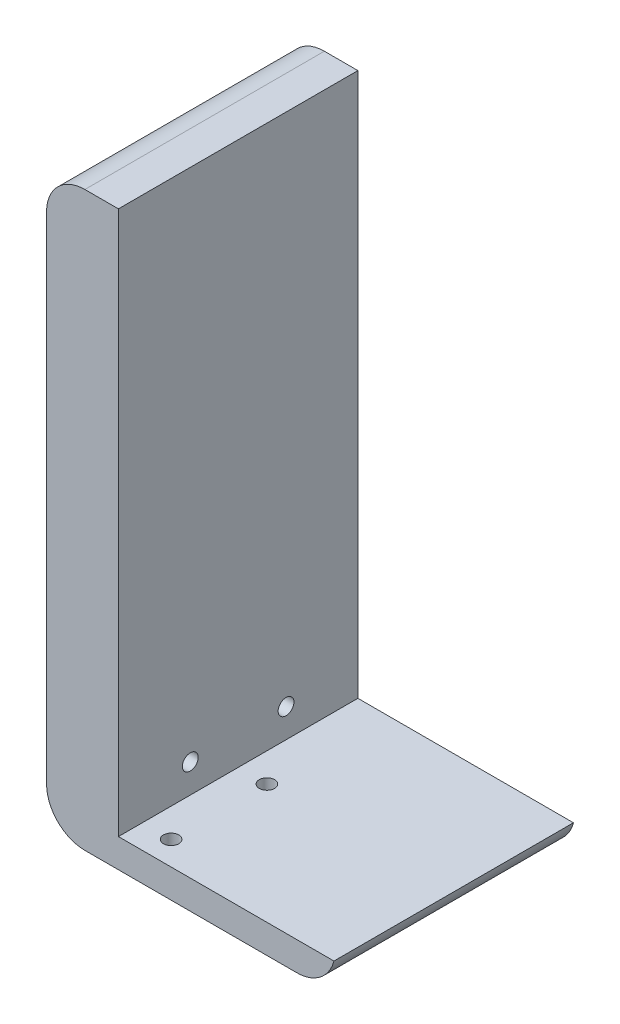
ISO-10303-21;
HEADER;
FILE_DESCRIPTION(('STEP AP214'),'2;1');
FILE_NAME('part.step','',(''),(''),'','','');
FILE_SCHEMA(('AUTOMOTIVE_DESIGN { 1 0 10303 214 1 1 1 1 }'));
ENDSEC;
DATA;
#1=APPLICATION_CONTEXT('core data for automotive mechanical design processes');
#2=APPLICATION_PROTOCOL_DEFINITION('international standard','automotive_design',2000,#1);
#3=PRODUCT_CONTEXT('',#1,'mechanical');
#4=PRODUCT('Part','Part','',(#3));
#5=PRODUCT_RELATED_PRODUCT_CATEGORY('part','',(#4));
#6=PRODUCT_DEFINITION_FORMATION('','',#4);
#7=PRODUCT_DEFINITION_CONTEXT('part definition',#1,'design');
#8=PRODUCT_DEFINITION('design','',#6,#7);
#9=PRODUCT_DEFINITION_SHAPE('','',#8);
#10=(LENGTH_UNIT() NAMED_UNIT(*) SI_UNIT(.MILLI.,.METRE.));
#11=(NAMED_UNIT(*) PLANE_ANGLE_UNIT() SI_UNIT($,.RADIAN.));
#12=(NAMED_UNIT(*) SI_UNIT($,.STERADIAN.) SOLID_ANGLE_UNIT());
#13=UNCERTAINTY_MEASURE_WITH_UNIT(LENGTH_MEASURE(1.E-05),#10,'distance_accuracy_value','');
#14=(GEOMETRIC_REPRESENTATION_CONTEXT(3) GLOBAL_UNCERTAINTY_ASSIGNED_CONTEXT((#13)) GLOBAL_UNIT_ASSIGNED_CONTEXT((#10,
#11,#12)) REPRESENTATION_CONTEXT('',''));
#15=CARTESIAN_POINT('',(0.,0.,0.));
#16=DIRECTION('',(0.,0.,1.));
#17=DIRECTION('',(1.,0.,0.));
#18=AXIS2_PLACEMENT_3D('',#15,#16,#17);
#19=CARTESIAN_POINT('',(60.,0.,25.));
#20=DIRECTION('',(0.,1.,0.));
#21=DIRECTION('',(-1.,0.,0.));
#22=AXIS2_PLACEMENT_3D('',#19,#20,#21);
#23=PLANE('',#22);
#24=CARTESIAN_POINT('',(21.0000000000001,0.,20.));
#25=DIRECTION('',(0.,1.,0.));
#26=DIRECTION('',(0.,0.,1.));
#27=AXIS2_PLACEMENT_3D('',#24,#25,#26);
#28=CIRCLE('',#27,1.6);
#29=CARTESIAN_POINT('',(21.0000000000001,0.,21.6));
#30=VERTEX_POINT('',#29);
#31=EDGE_CURVE('E189',#30,#30,#28,.T.);
#32=ORIENTED_EDGE('',*,*,#31,.T.);
#33=EDGE_LOOP('',(#32));
#34=FACE_BOUND('',#33,.T.);
#35=CARTESIAN_POINT('',(21.0000000000001,0.,0.));
#36=DIRECTION('',(0.,1.,0.));
#37=DIRECTION('',(0.,0.,1.));
#38=AXIS2_PLACEMENT_3D('',#35,#36,#37);
#39=CIRCLE('',#38,1.6);
#40=CARTESIAN_POINT('',(21.0000000000001,0.,1.6));
#41=VERTEX_POINT('',#40);
#42=EDGE_CURVE('E194',#41,#41,#39,.T.);
#43=ORIENTED_EDGE('',*,*,#42,.T.);
#44=EDGE_LOOP('',(#43));
#45=FACE_BOUND('',#44,.T.);
#46=DIRECTION('',(1.,0.,0.));
#47=VECTOR('',#46,1.);
#48=CARTESIAN_POINT('',(60.,0.,-25.));
#49=LINE('',#48,#47);
#50=CARTESIAN_POINT('',(8.,0.,-25.));
#51=VERTEX_POINT('',#50);
#52=CARTESIAN_POINT('',(52.2540333075852,0.,-25.));
#53=VERTEX_POINT('',#52);
#54=EDGE_CURVE('E150',#51,#53,#49,.T.);
#55=ORIENTED_EDGE('',*,*,#54,.T.);
#56=DIRECTION('',(0.,0.,1.));
#57=VECTOR('',#56,1.);
#58=CARTESIAN_POINT('',(52.2540333075852,0.,25.));
#59=LINE('',#58,#57);
#60=CARTESIAN_POINT('',(52.2540333075852,0.,25.));
#61=VERTEX_POINT('',#60);
#62=EDGE_CURVE('E11',#53,#61,#59,.T.);
#63=ORIENTED_EDGE('',*,*,#62,.T.);
#64=DIRECTION('',(1.,0.,0.));
#65=VECTOR('',#64,1.);
#66=CARTESIAN_POINT('',(60.,0.,25.));
#67=LINE('',#66,#65);
#68=CARTESIAN_POINT('',(8.,0.,25.));
#69=VERTEX_POINT('',#68);
#70=EDGE_CURVE('E109',#69,#61,#67,.T.);
#71=ORIENTED_EDGE('',*,*,#70,.F.);
#72=DIRECTION('',(0.,0.,-1.));
#73=VECTOR('',#72,1.);
#74=CARTESIAN_POINT('',(8.,0.,25.));
#75=LINE('',#74,#73);
#76=EDGE_CURVE('E47',#69,#51,#75,.T.);
#77=ORIENTED_EDGE('',*,*,#76,.T.);
#78=EDGE_LOOP('',(#55,#63,#71,#77));
#79=FACE_BOUND('',#78,.T.);
#80=ADVANCED_FACE('F41',(#34,#45,#79),#23,.F.);
#81=CARTESIAN_POINT('',(15.,6.,25.));
#82=DIRECTION('',(0.,-1.,0.));
#83=DIRECTION('',(0.,0.,-1.));
#84=AXIS2_PLACEMENT_3D('',#81,#82,#83);
#85=PLANE('',#84);
#86=CARTESIAN_POINT('',(21.0000000000001,6.,20.));
#87=DIRECTION('',(0.,1.,0.));
#88=DIRECTION('',(0.,0.,1.));
#89=AXIS2_PLACEMENT_3D('',#86,#87,#88);
#90=CIRCLE('',#89,1.6);
#91=CARTESIAN_POINT('',(21.0000000000001,6.,21.6));
#92=VERTEX_POINT('',#91);
#93=EDGE_CURVE('E200',#92,#92,#90,.T.);
#94=ORIENTED_EDGE('',*,*,#93,.F.);
#95=EDGE_LOOP('',(#94));
#96=FACE_BOUND('',#95,.T.);
#97=CARTESIAN_POINT('',(21.0000000000001,6.,0.));
#98=DIRECTION('',(0.,1.,0.));
#99=DIRECTION('',(0.,0.,1.));
#100=AXIS2_PLACEMENT_3D('',#97,#98,#99);
#101=CIRCLE('',#100,1.6);
#102=CARTESIAN_POINT('',(21.0000000000001,6.,1.6));
#103=VERTEX_POINT('',#102);
#104=EDGE_CURVE('E193',#103,#103,#101,.T.);
#105=ORIENTED_EDGE('',*,*,#104,.F.);
#106=EDGE_LOOP('',(#105));
#107=FACE_BOUND('',#106,.T.);
#108=DIRECTION('',(-1.,0.,0.));
#109=VECTOR('',#108,1.);
#110=CARTESIAN_POINT('',(15.,6.,-25.));
#111=LINE('',#110,#109);
#112=CARTESIAN_POINT('',(60.,6.,-25.));
#113=VERTEX_POINT('',#112);
#114=CARTESIAN_POINT('',(15.,6.,-25.));
#115=VERTEX_POINT('',#114);
#116=EDGE_CURVE('E153',#113,#115,#111,.T.);
#117=ORIENTED_EDGE('',*,*,#116,.T.);
#118=DIRECTION('',(0.,0.,-1.));
#119=VECTOR('',#118,1.);
#120=CARTESIAN_POINT('',(15.,6.,25.));
#121=LINE('',#120,#119);
#122=CARTESIAN_POINT('',(15.,6.,25.));
#123=VERTEX_POINT('',#122);
#124=EDGE_CURVE('E122',#123,#115,#121,.T.);
#125=ORIENTED_EDGE('',*,*,#124,.F.);
#126=DIRECTION('',(-1.,0.,0.));
#127=VECTOR('',#126,1.);
#128=CARTESIAN_POINT('',(15.,6.,25.));
#129=LINE('',#128,#127);
#130=CARTESIAN_POINT('',(60.,6.,25.));
#131=VERTEX_POINT('',#130);
#132=EDGE_CURVE('E108',#131,#123,#129,.T.);
#133=ORIENTED_EDGE('',*,*,#132,.F.);
#134=DIRECTION('',(0.,0.,-1.));
#135=VECTOR('',#134,1.);
#136=CARTESIAN_POINT('',(60.,6.,25.));
#137=LINE('',#136,#135);
#138=EDGE_CURVE('E117',#131,#113,#137,.T.);
#139=ORIENTED_EDGE('',*,*,#138,.T.);
#140=EDGE_LOOP('',(#117,#125,#133,#139));
#141=FACE_BOUND('',#140,.T.);
#142=ADVANCED_FACE('F120',(#96,#107,#141),#85,.F.);
#143=CARTESIAN_POINT('',(15.,119.5,25.));
#144=DIRECTION('',(-1.,0.,0.));
#145=DIRECTION('',(0.,-1.,0.));
#146=AXIS2_PLACEMENT_3D('',#143,#144,#145);
#147=PLANE('',#146);
#148=CARTESIAN_POINT('',(15.,12.,10.));
#149=DIRECTION('',(-1.,0.,0.));
#150=DIRECTION('',(0.,-1.,0.));
#151=AXIS2_PLACEMENT_3D('',#148,#149,#150);
#152=CIRCLE('',#151,1.65);
#153=CARTESIAN_POINT('',(15.,12.,11.65));
#154=VERTEX_POINT('',#153);
#155=EDGE_CURVE('E154',#154,#154,#152,.T.);
#156=ORIENTED_EDGE('',*,*,#155,.T.);
#157=EDGE_LOOP('',(#156));
#158=FACE_BOUND('',#157,.T.);
#159=CARTESIAN_POINT('',(15.,12.,-10.));
#160=DIRECTION('',(-1.,0.,0.));
#161=DIRECTION('',(0.,-1.,0.));
#162=AXIS2_PLACEMENT_3D('',#159,#160,#161);
#163=CIRCLE('',#162,1.65);
#164=CARTESIAN_POINT('',(15.,12.,-8.35));
#165=VERTEX_POINT('',#164);
#166=EDGE_CURVE('E159',#165,#165,#163,.T.);
#167=ORIENTED_EDGE('',*,*,#166,.T.);
#168=EDGE_LOOP('',(#167));
#169=FACE_BOUND('',#168,.T.);
#170=DIRECTION('',(0.,1.,0.));
#171=VECTOR('',#170,1.);
#172=CARTESIAN_POINT('',(15.,119.5,-25.));
#173=LINE('',#172,#171);
#174=CARTESIAN_POINT('',(15.,119.5,-25.));
#175=VERTEX_POINT('',#174);
#176=EDGE_CURVE('E160',#115,#175,#173,.T.);
#177=ORIENTED_EDGE('',*,*,#176,.T.);
#178=DIRECTION('',(0.,0.,-1.));
#179=VECTOR('',#178,1.);
#180=CARTESIAN_POINT('',(15.,119.5,25.));
#181=LINE('',#180,#179);
#182=CARTESIAN_POINT('',(15.,119.5,25.));
#183=VERTEX_POINT('',#182);
#184=EDGE_CURVE('E131',#183,#175,#181,.T.);
#185=ORIENTED_EDGE('',*,*,#184,.F.);
#186=DIRECTION('',(0.,1.,0.));
#187=VECTOR('',#186,1.);
#188=CARTESIAN_POINT('',(15.,119.5,25.));
#189=LINE('',#188,#187);
#190=EDGE_CURVE('E124',#123,#183,#189,.T.);
#191=ORIENTED_EDGE('',*,*,#190,.F.);
#192=ORIENTED_EDGE('',*,*,#124,.T.);
#193=EDGE_LOOP('',(#177,#185,#191,#192));
#194=FACE_BOUND('',#193,.T.);
#195=ADVANCED_FACE('F213',(#158,#169,#194),#147,.F.);
#196=CARTESIAN_POINT('',(0.,119.5,25.));
#197=DIRECTION('',(0.,-1.,0.));
#198=DIRECTION('',(0.,0.,-1.));
#199=AXIS2_PLACEMENT_3D('',#196,#197,#198);
#200=PLANE('',#199);
#201=DIRECTION('',(-1.,0.,0.));
#202=VECTOR('',#201,1.);
#203=CARTESIAN_POINT('',(0.,119.5,-25.));
#204=LINE('',#203,#202);
#205=CARTESIAN_POINT('',(8.,119.5,-25.));
#206=VERTEX_POINT('',#205);
#207=EDGE_CURVE('E170',#175,#206,#204,.T.);
#208=ORIENTED_EDGE('',*,*,#207,.T.);
#209=DIRECTION('',(0.,0.,-1.));
#210=VECTOR('',#209,1.);
#211=CARTESIAN_POINT('',(8.,119.5,25.));
#212=LINE('',#211,#210);
#213=CARTESIAN_POINT('',(8.,119.5,25.));
#214=VERTEX_POINT('',#213);
#215=EDGE_CURVE('E145',#206,#214,#212,.F.);
#216=ORIENTED_EDGE('',*,*,#215,.T.);
#217=DIRECTION('',(-1.,0.,0.));
#218=VECTOR('',#217,1.);
#219=CARTESIAN_POINT('',(0.,119.5,25.));
#220=LINE('',#219,#218);
#221=EDGE_CURVE('E176',#183,#214,#220,.T.);
#222=ORIENTED_EDGE('',*,*,#221,.F.);
#223=ORIENTED_EDGE('',*,*,#184,.T.);
#224=EDGE_LOOP('',(#208,#216,#222,#223));
#225=FACE_BOUND('',#224,.T.);
#226=ADVANCED_FACE('F251',(#225),#200,.F.);
#227=CARTESIAN_POINT('',(0.,0.,25.));
#228=DIRECTION('',(1.,0.,0.));
#229=DIRECTION('',(0.,0.,-1.));
#230=AXIS2_PLACEMENT_3D('',#227,#228,#229);
#231=PLANE('',#230);
#232=CARTESIAN_POINT('',(0.,12.,10.));
#233=DIRECTION('',(-1.,0.,0.));
#234=DIRECTION('',(0.,0.,1.));
#235=AXIS2_PLACEMENT_3D('',#232,#233,#234);
#236=CIRCLE('',#235,1.65);
#237=CARTESIAN_POINT('',(0.,12.,11.65));
#238=VERTEX_POINT('',#237);
#239=EDGE_CURVE('E183',#238,#238,#236,.T.);
#240=ORIENTED_EDGE('',*,*,#239,.F.);
#241=EDGE_LOOP('',(#240));
#242=FACE_BOUND('',#241,.T.);
#243=CARTESIAN_POINT('',(0.,12.,-10.));
#244=DIRECTION('',(-1.,0.,0.));
#245=DIRECTION('',(0.,0.,1.));
#246=AXIS2_PLACEMENT_3D('',#243,#244,#245);
#247=CIRCLE('',#246,1.65);
#248=CARTESIAN_POINT('',(0.,12.,-8.35));
#249=VERTEX_POINT('',#248);
#250=EDGE_CURVE('E184',#249,#249,#247,.T.);
#251=ORIENTED_EDGE('',*,*,#250,.F.);
#252=EDGE_LOOP('',(#251));
#253=FACE_BOUND('',#252,.T.);
#254=DIRECTION('',(0.,-1.,0.));
#255=VECTOR('',#254,1.);
#256=CARTESIAN_POINT('',(0.,0.,25.));
#257=LINE('',#256,#255);
#258=CARTESIAN_POINT('',(0.,111.5,25.));
#259=VERTEX_POINT('',#258);
#260=CARTESIAN_POINT('',(0.,8.,25.));
#261=VERTEX_POINT('',#260);
#262=EDGE_CURVE('E161',#259,#261,#257,.T.);
#263=ORIENTED_EDGE('',*,*,#262,.F.);
#264=DIRECTION('',(0.,0.,-1.));
#265=VECTOR('',#264,1.);
#266=CARTESIAN_POINT('',(0.,111.5,25.));
#267=LINE('',#266,#265);
#268=CARTESIAN_POINT('',(0.,111.5,-25.));
#269=VERTEX_POINT('',#268);
#270=EDGE_CURVE('E128',#259,#269,#267,.T.);
#271=ORIENTED_EDGE('',*,*,#270,.T.);
#272=DIRECTION('',(0.,-1.,0.));
#273=VECTOR('',#272,1.);
#274=CARTESIAN_POINT('',(0.,0.,-25.));
#275=LINE('',#274,#273);
#276=CARTESIAN_POINT('',(0.,8.,-25.));
#277=VERTEX_POINT('',#276);
#278=EDGE_CURVE('E167',#269,#277,#275,.T.);
#279=ORIENTED_EDGE('',*,*,#278,.T.);
#280=DIRECTION('',(0.,0.,-1.));
#281=VECTOR('',#280,1.);
#282=CARTESIAN_POINT('',(0.,8.,25.));
#283=LINE('',#282,#281);
#284=EDGE_CURVE('E126',#277,#261,#283,.F.);
#285=ORIENTED_EDGE('',*,*,#284,.T.);
#286=EDGE_LOOP('',(#263,#271,#279,#285));
#287=FACE_BOUND('',#286,.T.);
#288=ADVANCED_FACE('F249',(#242,#253,#287),#231,.F.);
#289=CARTESIAN_POINT('',(0.,0.,25.));
#290=DIRECTION('',(0.,0.,-1.));
#291=DIRECTION('',(-1.,0.,0.));
#292=AXIS2_PLACEMENT_3D('',#289,#290,#291);
#293=PLANE('',#292);
#294=ORIENTED_EDGE('',*,*,#221,.T.);
#295=CARTESIAN_POINT('',(8.,111.5,25.));
#296=DIRECTION('',(0.,0.,-1.));
#297=DIRECTION('',(-1.,0.,0.));
#298=AXIS2_PLACEMENT_3D('',#295,#296,#297);
#299=CIRCLE('',#298,8.);
#300=EDGE_CURVE('E113',#214,#259,#299,.F.);
#301=ORIENTED_EDGE('',*,*,#300,.T.);
#302=ORIENTED_EDGE('',*,*,#262,.T.);
#303=CARTESIAN_POINT('',(8.,8.,25.));
#304=DIRECTION('',(0.,0.,-1.));
#305=DIRECTION('',(-1.,0.,0.));
#306=AXIS2_PLACEMENT_3D('',#303,#304,#305);
#307=CIRCLE('',#306,8.);
#308=EDGE_CURVE('E64',#261,#69,#307,.F.);
#309=ORIENTED_EDGE('',*,*,#308,.T.);
#310=ORIENTED_EDGE('',*,*,#70,.T.);
#311=CARTESIAN_POINT('',(52.2540333075852,8.,25.));
#312=DIRECTION('',(0.,0.,-1.));
#313=DIRECTION('',(-1.,0.,0.));
#314=AXIS2_PLACEMENT_3D('',#311,#312,#313);
#315=CIRCLE('',#314,8.);
#316=EDGE_CURVE('E104',#61,#131,#315,.F.);
#317=ORIENTED_EDGE('',*,*,#316,.T.);
#318=ORIENTED_EDGE('',*,*,#132,.T.);
#319=ORIENTED_EDGE('',*,*,#190,.T.);
#320=EDGE_LOOP('',(#294,#301,#302,#309,#310,#317,#318,#319));
#321=FACE_BOUND('',#320,.T.);
#322=ADVANCED_FACE('F110',(#321),#293,.F.);
#323=CARTESIAN_POINT('',(0.,0.,-25.));
#324=DIRECTION('',(0.,0.,-1.));
#325=DIRECTION('',(-1.,0.,0.));
#326=AXIS2_PLACEMENT_3D('',#323,#324,#325);
#327=PLANE('',#326);
#328=ORIENTED_EDGE('',*,*,#278,.F.);
#329=CARTESIAN_POINT('',(8.,111.5,-25.));
#330=DIRECTION('',(0.,0.,-1.));
#331=DIRECTION('',(-1.,0.,0.));
#332=AXIS2_PLACEMENT_3D('',#329,#330,#331);
#333=CIRCLE('',#332,8.);
#334=EDGE_CURVE('E139',#269,#206,#333,.T.);
#335=ORIENTED_EDGE('',*,*,#334,.T.);
#336=ORIENTED_EDGE('',*,*,#207,.F.);
#337=ORIENTED_EDGE('',*,*,#176,.F.);
#338=ORIENTED_EDGE('',*,*,#116,.F.);
#339=CARTESIAN_POINT('',(52.2540333075852,8.,-25.));
#340=DIRECTION('',(0.,0.,-1.));
#341=DIRECTION('',(-1.,0.,0.));
#342=AXIS2_PLACEMENT_3D('',#339,#340,#341);
#343=CIRCLE('',#342,8.);
#344=EDGE_CURVE('E129',#113,#53,#343,.T.);
#345=ORIENTED_EDGE('',*,*,#344,.T.);
#346=ORIENTED_EDGE('',*,*,#54,.F.);
#347=CARTESIAN_POINT('',(8.,8.,-25.));
#348=DIRECTION('',(0.,0.,-1.));
#349=DIRECTION('',(-1.,0.,0.));
#350=AXIS2_PLACEMENT_3D('',#347,#348,#349);
#351=CIRCLE('',#350,8.);
#352=EDGE_CURVE('E140',#51,#277,#351,.T.);
#353=ORIENTED_EDGE('',*,*,#352,.T.);
#354=EDGE_LOOP('',(#328,#335,#336,#337,#338,#345,#346,#353));
#355=FACE_BOUND('',#354,.T.);
#356=ADVANCED_FACE('F155',(#355),#327,.T.);
#357=CARTESIAN_POINT('',(8.,111.5,25.));
#358=DIRECTION('',(0.,0.,-1.));
#359=DIRECTION('',(-1.,0.,0.));
#360=AXIS2_PLACEMENT_3D('',#357,#358,#359);
#361=CYLINDRICAL_SURFACE('',#360,8.);
#362=ORIENTED_EDGE('',*,*,#300,.F.);
#363=ORIENTED_EDGE('',*,*,#215,.F.);
#364=ORIENTED_EDGE('',*,*,#334,.F.);
#365=ORIENTED_EDGE('',*,*,#270,.F.);
#366=EDGE_LOOP('',(#362,#363,#364,#365));
#367=FACE_BOUND('',#366,.T.);
#368=ADVANCED_FACE('F232',(#367),#361,.T.);
#369=CARTESIAN_POINT('',(52.2540333075852,8.,25.));
#370=DIRECTION('',(0.,0.,1.));
#371=DIRECTION('',(1.,0.,0.));
#372=AXIS2_PLACEMENT_3D('',#369,#370,#371);
#373=CYLINDRICAL_SURFACE('',#372,8.);
#374=ORIENTED_EDGE('',*,*,#316,.F.);
#375=ORIENTED_EDGE('',*,*,#62,.F.);
#376=ORIENTED_EDGE('',*,*,#344,.F.);
#377=ORIENTED_EDGE('',*,*,#138,.F.);
#378=EDGE_LOOP('',(#374,#375,#376,#377));
#379=FACE_BOUND('',#378,.T.);
#380=ADVANCED_FACE('F123',(#379),#373,.T.);
#381=CARTESIAN_POINT('',(8.,8.,25.));
#382=DIRECTION('',(0.,0.,-1.));
#383=DIRECTION('',(-1.,0.,0.));
#384=AXIS2_PLACEMENT_3D('',#381,#382,#383);
#385=CYLINDRICAL_SURFACE('',#384,8.);
#386=ORIENTED_EDGE('',*,*,#308,.F.);
#387=ORIENTED_EDGE('',*,*,#284,.F.);
#388=ORIENTED_EDGE('',*,*,#352,.F.);
#389=ORIENTED_EDGE('',*,*,#76,.F.);
#390=EDGE_LOOP('',(#386,#387,#388,#389));
#391=FACE_BOUND('',#390,.T.);
#392=ADVANCED_FACE('F43',(#391),#385,.T.);
#393=CARTESIAN_POINT('',(60.,12.,-10.));
#394=DIRECTION('',(-1.,0.,0.));
#395=DIRECTION('',(0.,0.,1.));
#396=AXIS2_PLACEMENT_3D('',#393,#394,#395);
#397=CYLINDRICAL_SURFACE('',#396,1.65);
#398=CARTESIAN_POINT('',(0.,12.,-8.35));
#399=CARTESIAN_POINT('',(0.156250000000002,12.,-8.35));
#400=CARTESIAN_POINT('',(0.312500000000003,12.,-8.35));
#401=CARTESIAN_POINT('',(0.625000000000003,12.,-8.35));
#402=CARTESIAN_POINT('',(0.781250000000002,12.,-8.35));
#403=CARTESIAN_POINT('',(1.09375,12.,-8.35));
#404=CARTESIAN_POINT('',(1.25,12.,-8.35));
#405=CARTESIAN_POINT('',(1.5625,12.,-8.35));
#406=CARTESIAN_POINT('',(1.71875,12.,-8.35));
#407=CARTESIAN_POINT('',(2.03125,12.,-8.35));
#408=CARTESIAN_POINT('',(2.1875,12.,-8.35));
#409=CARTESIAN_POINT('',(2.5,12.,-8.35));
#410=CARTESIAN_POINT('',(2.65625,12.,-8.35));
#411=CARTESIAN_POINT('',(2.96875,12.,-8.35));
#412=CARTESIAN_POINT('',(3.125,12.,-8.35));
#413=CARTESIAN_POINT('',(3.4375,12.,-8.35));
#414=CARTESIAN_POINT('',(3.59375,12.,-8.35));
#415=CARTESIAN_POINT('',(3.90625,12.,-8.35));
#416=CARTESIAN_POINT('',(4.06250000000001,12.,-8.35));
#417=CARTESIAN_POINT('',(4.37500000000001,12.,-8.35));
#418=CARTESIAN_POINT('',(4.53125000000001,12.,-8.35));
#419=CARTESIAN_POINT('',(4.84375,12.,-8.35));
#420=CARTESIAN_POINT('',(5.,12.,-8.35));
#421=CARTESIAN_POINT('',(5.3125,12.,-8.35));
#422=CARTESIAN_POINT('',(5.46875,12.,-8.35));
#423=CARTESIAN_POINT('',(5.78125000000001,12.,-8.35));
#424=CARTESIAN_POINT('',(5.93750000000001,12.,-8.35));
#425=CARTESIAN_POINT('',(6.25000000000001,12.,-8.35));
#426=CARTESIAN_POINT('',(6.40625000000001,12.,-8.35));
#427=CARTESIAN_POINT('',(6.71875000000001,12.,-8.35));
#428=CARTESIAN_POINT('',(6.875,12.,-8.35));
#429=CARTESIAN_POINT('',(7.1875,12.,-8.35));
#430=CARTESIAN_POINT('',(7.34375000000001,12.,-8.35));
#431=CARTESIAN_POINT('',(7.65625000000001,12.,-8.35));
#432=CARTESIAN_POINT('',(7.81250000000001,12.,-8.35));
#433=CARTESIAN_POINT('',(8.12500000000001,12.,-8.35));
#434=CARTESIAN_POINT('',(8.28125000000001,12.,-8.35));
#435=CARTESIAN_POINT('',(8.59375000000001,12.,-8.35));
#436=CARTESIAN_POINT('',(8.75000000000001,12.,-8.35));
#437=CARTESIAN_POINT('',(9.06250000000001,12.,-8.35));
#438=CARTESIAN_POINT('',(9.21875000000001,12.,-8.35));
#439=CARTESIAN_POINT('',(9.53125000000001,12.,-8.35));
#440=CARTESIAN_POINT('',(9.68750000000001,12.,-8.35));
#441=CARTESIAN_POINT('',(10.,12.,-8.35));
#442=CARTESIAN_POINT('',(10.15625,12.,-8.35));
#443=CARTESIAN_POINT('',(10.46875,12.,-8.35));
#444=CARTESIAN_POINT('',(10.625,12.,-8.35));
#445=CARTESIAN_POINT('',(10.9375,12.,-8.35));
#446=CARTESIAN_POINT('',(11.09375,12.,-8.35));
#447=CARTESIAN_POINT('',(11.40625,12.,-8.35));
#448=CARTESIAN_POINT('',(11.5625,12.,-8.35));
#449=CARTESIAN_POINT('',(11.875,12.,-8.35));
#450=CARTESIAN_POINT('',(12.03125,12.,-8.35));
#451=CARTESIAN_POINT('',(12.34375,12.,-8.35));
#452=CARTESIAN_POINT('',(12.5,12.,-8.35));
#453=CARTESIAN_POINT('',(12.8125,12.,-8.35));
#454=CARTESIAN_POINT('',(12.96875,12.,-8.35));
#455=CARTESIAN_POINT('',(13.28125,12.,-8.35));
#456=CARTESIAN_POINT('',(13.4375,12.,-8.35));
#457=CARTESIAN_POINT('',(13.75,12.,-8.35));
#458=CARTESIAN_POINT('',(13.90625,12.,-8.35));
#459=CARTESIAN_POINT('',(14.21875,12.,-8.35));
#460=CARTESIAN_POINT('',(14.375,12.,-8.35));
#461=CARTESIAN_POINT('',(14.6875,12.,-8.35));
#462=CARTESIAN_POINT('',(14.84375,12.,-8.35));
#463=CARTESIAN_POINT('',(15.,12.,-8.35));
#464=B_SPLINE_CURVE_WITH_KNOTS('',3,(#398,#399,#400,#401,#402,#403,#404,#405,#406,#407,#408,
#409,#410,#411,#412,#413,#414,#415,#416,#417,#418,#419,#420,#421,#422,#423,#424,#425,#426,#427,
#428,#429,#430,#431,#432,#433,#434,#435,#436,#437,#438,#439,#440,#441,#442,#443,#444,#445,#446,
#447,#448,#449,#450,#451,#452,#453,#454,#455,#456,#457,#458,#459,#460,#461,#462,#463),
.UNSPECIFIED.,.F.,.F.,(4,2,2,2,2,2,2,2,2,2,2,2,2,2,2,2,2,2,2,2,2,2,2,2,2,2,2,2,2,2,2,2,4),(0.,
0.468750000000004,0.937500000000001,1.40625,1.875,2.34375000000001,2.8125,3.28125,3.75,
4.21875000000001,4.6875,5.15625,5.62500000000001,6.09375000000001,6.56250000000001,7.03125,
7.50000000000001,7.96875000000001,8.43750000000001,8.90625,9.37500000000001,9.84375000000001,
10.3125,10.78125,11.25,11.71875,12.1875,12.65625,13.125,13.59375,14.0625,14.53125,15.),.UNSPECIFIED.);
#465=EDGE_CURVE('BSEAM224',#249,#165,#464,.T.);
#466=ORIENTED_EDGE('',*,*,#250,.T.);
#467=ORIENTED_EDGE('',*,*,#166,.F.);
#468=ORIENTED_EDGE('',*,*,#465,.T.);
#469=ORIENTED_EDGE('',*,*,#465,.F.);
#470=EDGE_LOOP('',(#466,#468,#467,#469));
#471=FACE_BOUND('',#470,.T.);
#472=ADVANCED_FACE('F224',(#471),#397,.F.);
#473=CARTESIAN_POINT('',(60.,12.,10.));
#474=DIRECTION('',(-1.,0.,0.));
#475=DIRECTION('',(0.,0.,1.));
#476=AXIS2_PLACEMENT_3D('',#473,#474,#475);
#477=CYLINDRICAL_SURFACE('',#476,1.65);
#478=CARTESIAN_POINT('',(0.,12.,11.65));
#479=CARTESIAN_POINT('',(0.156250000000002,12.,11.65));
#480=CARTESIAN_POINT('',(0.312500000000003,12.,11.65));
#481=CARTESIAN_POINT('',(0.625000000000003,12.,11.65));
#482=CARTESIAN_POINT('',(0.781250000000002,12.,11.65));
#483=CARTESIAN_POINT('',(1.09375,12.,11.65));
#484=CARTESIAN_POINT('',(1.25,12.,11.65));
#485=CARTESIAN_POINT('',(1.5625,12.,11.65));
#486=CARTESIAN_POINT('',(1.71875,12.,11.65));
#487=CARTESIAN_POINT('',(2.03125,12.,11.65));
#488=CARTESIAN_POINT('',(2.1875,12.,11.65));
#489=CARTESIAN_POINT('',(2.5,12.,11.65));
#490=CARTESIAN_POINT('',(2.65625,12.,11.65));
#491=CARTESIAN_POINT('',(2.96875,12.,11.65));
#492=CARTESIAN_POINT('',(3.125,12.,11.65));
#493=CARTESIAN_POINT('',(3.4375,12.,11.65));
#494=CARTESIAN_POINT('',(3.59375,12.,11.65));
#495=CARTESIAN_POINT('',(3.90625,12.,11.65));
#496=CARTESIAN_POINT('',(4.06250000000001,12.,11.65));
#497=CARTESIAN_POINT('',(4.37500000000001,12.,11.65));
#498=CARTESIAN_POINT('',(4.53125000000001,12.,11.65));
#499=CARTESIAN_POINT('',(4.84375,12.,11.65));
#500=CARTESIAN_POINT('',(5.,12.,11.65));
#501=CARTESIAN_POINT('',(5.3125,12.,11.65));
#502=CARTESIAN_POINT('',(5.46875,12.,11.65));
#503=CARTESIAN_POINT('',(5.78125000000001,12.,11.65));
#504=CARTESIAN_POINT('',(5.93750000000001,12.,11.65));
#505=CARTESIAN_POINT('',(6.25000000000001,12.,11.65));
#506=CARTESIAN_POINT('',(6.40625000000001,12.,11.65));
#507=CARTESIAN_POINT('',(6.71875000000001,12.,11.65));
#508=CARTESIAN_POINT('',(6.875,12.,11.65));
#509=CARTESIAN_POINT('',(7.1875,12.,11.65));
#510=CARTESIAN_POINT('',(7.34375000000001,12.,11.65));
#511=CARTESIAN_POINT('',(7.65625000000001,12.,11.65));
#512=CARTESIAN_POINT('',(7.81250000000001,12.,11.65));
#513=CARTESIAN_POINT('',(8.12500000000001,12.,11.65));
#514=CARTESIAN_POINT('',(8.28125000000001,12.,11.65));
#515=CARTESIAN_POINT('',(8.59375000000001,12.,11.65));
#516=CARTESIAN_POINT('',(8.75000000000001,12.,11.65));
#517=CARTESIAN_POINT('',(9.06250000000001,12.,11.65));
#518=CARTESIAN_POINT('',(9.21875000000001,12.,11.65));
#519=CARTESIAN_POINT('',(9.53125000000001,12.,11.65));
#520=CARTESIAN_POINT('',(9.68750000000001,12.,11.65));
#521=CARTESIAN_POINT('',(10.,12.,11.65));
#522=CARTESIAN_POINT('',(10.15625,12.,11.65));
#523=CARTESIAN_POINT('',(10.46875,12.,11.65));
#524=CARTESIAN_POINT('',(10.625,12.,11.65));
#525=CARTESIAN_POINT('',(10.9375,12.,11.65));
#526=CARTESIAN_POINT('',(11.09375,12.,11.65));
#527=CARTESIAN_POINT('',(11.40625,12.,11.65));
#528=CARTESIAN_POINT('',(11.5625,12.,11.65));
#529=CARTESIAN_POINT('',(11.875,12.,11.65));
#530=CARTESIAN_POINT('',(12.03125,12.,11.65));
#531=CARTESIAN_POINT('',(12.34375,12.,11.65));
#532=CARTESIAN_POINT('',(12.5,12.,11.65));
#533=CARTESIAN_POINT('',(12.8125,12.,11.65));
#534=CARTESIAN_POINT('',(12.96875,12.,11.65));
#535=CARTESIAN_POINT('',(13.28125,12.,11.65));
#536=CARTESIAN_POINT('',(13.4375,12.,11.65));
#537=CARTESIAN_POINT('',(13.75,12.,11.65));
#538=CARTESIAN_POINT('',(13.90625,12.,11.65));
#539=CARTESIAN_POINT('',(14.21875,12.,11.65));
#540=CARTESIAN_POINT('',(14.375,12.,11.65));
#541=CARTESIAN_POINT('',(14.6875,12.,11.65));
#542=CARTESIAN_POINT('',(14.84375,12.,11.65));
#543=CARTESIAN_POINT('',(15.,12.,11.65));
#544=B_SPLINE_CURVE_WITH_KNOTS('',3,(#478,#479,#480,#481,#482,#483,#484,#485,#486,#487,#488,
#489,#490,#491,#492,#493,#494,#495,#496,#497,#498,#499,#500,#501,#502,#503,#504,#505,#506,#507,
#508,#509,#510,#511,#512,#513,#514,#515,#516,#517,#518,#519,#520,#521,#522,#523,#524,#525,#526,
#527,#528,#529,#530,#531,#532,#533,#534,#535,#536,#537,#538,#539,#540,#541,#542,#543),
.UNSPECIFIED.,.F.,.F.,(4,2,2,2,2,2,2,2,2,2,2,2,2,2,2,2,2,2,2,2,2,2,2,2,2,2,2,2,2,2,2,2,4),(0.,
0.468750000000004,0.937500000000001,1.40625,1.875,2.34375000000001,2.8125,3.28125,3.75,
4.21875000000001,4.6875,5.15625,5.62500000000001,6.09375000000001,6.56250000000001,7.03125,
7.50000000000001,7.96875000000001,8.43750000000001,8.90625,9.37500000000001,9.84375000000001,
10.3125,10.78125,11.25,11.71875,12.1875,12.65625,13.125,13.59375,14.0625,14.53125,15.),.UNSPECIFIED.);
#545=EDGE_CURVE('BSEAM218',#238,#154,#544,.T.);
#546=ORIENTED_EDGE('',*,*,#239,.T.);
#547=ORIENTED_EDGE('',*,*,#155,.F.);
#548=ORIENTED_EDGE('',*,*,#545,.T.);
#549=ORIENTED_EDGE('',*,*,#545,.F.);
#550=EDGE_LOOP('',(#546,#548,#547,#549));
#551=FACE_BOUND('',#550,.T.);
#552=ADVANCED_FACE('F218',(#551),#477,.F.);
#553=CARTESIAN_POINT('',(21.0000000000001,0.,0.));
#554=DIRECTION('',(0.,1.,0.));
#555=DIRECTION('',(0.,0.,1.));
#556=AXIS2_PLACEMENT_3D('',#553,#554,#555);
#557=CYLINDRICAL_SURFACE('',#556,1.6);
#558=ORIENTED_EDGE('',*,*,#42,.F.);
#559=EDGE_LOOP('',(#558));
#560=FACE_BOUND('',#559,.T.);
#561=ORIENTED_EDGE('',*,*,#104,.T.);
#562=EDGE_LOOP('',(#561));
#563=FACE_BOUND('',#562,.T.);
#564=ADVANCED_FACE('F206',(#560,#563),#557,.F.);
#565=CARTESIAN_POINT('',(21.0000000000001,0.,20.));
#566=DIRECTION('',(0.,1.,0.));
#567=DIRECTION('',(0.,0.,1.));
#568=AXIS2_PLACEMENT_3D('',#565,#566,#567);
#569=CYLINDRICAL_SURFACE('',#568,1.6);
#570=ORIENTED_EDGE('',*,*,#31,.F.);
#571=EDGE_LOOP('',(#570));
#572=FACE_BOUND('',#571,.T.);
#573=ORIENTED_EDGE('',*,*,#93,.T.);
#574=EDGE_LOOP('',(#573));
#575=FACE_BOUND('',#574,.T.);
#576=ADVANCED_FACE('F204',(#572,#575),#569,.F.);
#577=CLOSED_SHELL('',(#80,#142,#195,#226,#288,#322,#356,#368,#380,#392,#472,#552,#564,#576));
#578=MANIFOLD_SOLID_BREP('B2',#577);
#579=ADVANCED_BREP_SHAPE_REPRESENTATION('',(#18,#578),#14);
#580=SHAPE_DEFINITION_REPRESENTATION(#9,#579);
ENDSEC;
END-ISO-10303-21;
